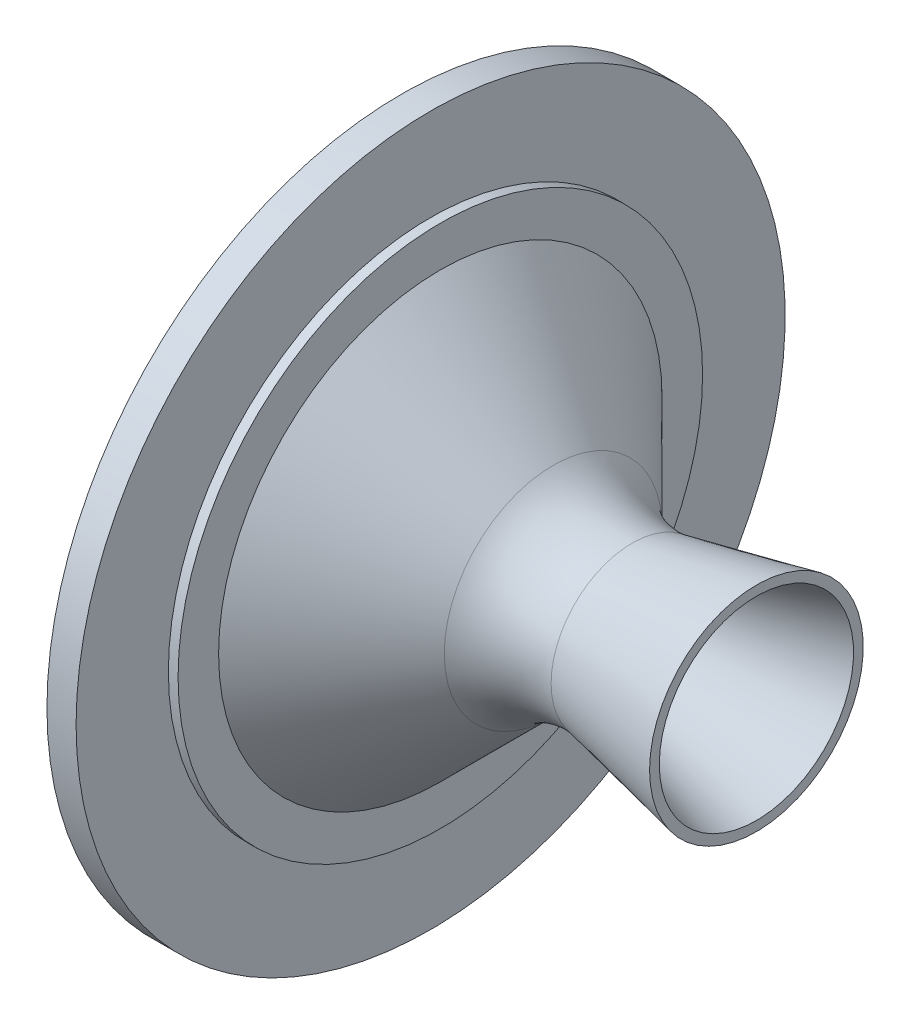
ISO-10303-21;
HEADER;
FILE_DESCRIPTION(('STEP AP214'),'2;1');
FILE_NAME('part.step','',(''),(''),'','','');
FILE_SCHEMA(('AUTOMOTIVE_DESIGN { 1 0 10303 214 1 1 1 1 }'));
ENDSEC;
DATA;
#1=APPLICATION_CONTEXT('core data for automotive mechanical design processes');
#2=APPLICATION_PROTOCOL_DEFINITION('international standard','automotive_design',2000,#1);
#3=PRODUCT_CONTEXT('',#1,'mechanical');
#4=PRODUCT('Part','Part','',(#3));
#5=PRODUCT_RELATED_PRODUCT_CATEGORY('part','',(#4));
#6=PRODUCT_DEFINITION_FORMATION('','',#4);
#7=PRODUCT_DEFINITION_CONTEXT('part definition',#1,'design');
#8=PRODUCT_DEFINITION('design','',#6,#7);
#9=PRODUCT_DEFINITION_SHAPE('','',#8);
#10=(LENGTH_UNIT() NAMED_UNIT(*) SI_UNIT(.MILLI.,.METRE.));
#11=(NAMED_UNIT(*) PLANE_ANGLE_UNIT() SI_UNIT($,.RADIAN.));
#12=(NAMED_UNIT(*) SI_UNIT($,.STERADIAN.) SOLID_ANGLE_UNIT());
#13=UNCERTAINTY_MEASURE_WITH_UNIT(LENGTH_MEASURE(1.E-05),#10,'distance_accuracy_value','');
#14=(GEOMETRIC_REPRESENTATION_CONTEXT(3) GLOBAL_UNCERTAINTY_ASSIGNED_CONTEXT((#13)) GLOBAL_UNIT_ASSIGNED_CONTEXT((#10,
#11,#12)) REPRESENTATION_CONTEXT('',''));
#15=CARTESIAN_POINT('',(0.,0.,0.));
#16=DIRECTION('',(0.,0.,1.));
#17=DIRECTION('',(1.,0.,0.));
#18=AXIS2_PLACEMENT_3D('',#15,#16,#17);
#19=CARTESIAN_POINT('',(-38.6300607834147,24.,0.));
#20=DIRECTION('',(1.,0.,0.));
#21=DIRECTION('',(0.,0.,-1.));
#22=AXIS2_PLACEMENT_3D('',#19,#20,#21);
#23=PLANE('',#22);
#24=CARTESIAN_POINT('',(-38.6300607834147,0.,0.));
#25=DIRECTION('',(-1.,0.,0.));
#26=DIRECTION('',(0.,0.,1.));
#27=AXIS2_PLACEMENT_3D('',#24,#25,#26);
#28=CIRCLE('',#27,24.);
#29=CARTESIAN_POINT('',(-38.6300607834147,0.,24.));
#30=VERTEX_POINT('',#29);
#31=EDGE_CURVE('E10',#30,#30,#28,.T.);
#32=ORIENTED_EDGE('',*,*,#31,.F.);
#33=EDGE_LOOP('',(#32));
#34=FACE_BOUND('',#33,.T.);
#35=CARTESIAN_POINT('',(-38.6300607834147,0.,0.));
#36=DIRECTION('',(-1.,0.,0.));
#37=DIRECTION('',(0.,0.,1.));
#38=AXIS2_PLACEMENT_3D('',#35,#36,#37);
#39=CIRCLE('',#38,36.5);
#40=CARTESIAN_POINT('',(-38.6300607834147,0.,36.5));
#41=VERTEX_POINT('',#40);
#42=EDGE_CURVE('E79',#41,#41,#39,.T.);
#43=ORIENTED_EDGE('',*,*,#42,.T.);
#44=EDGE_LOOP('',(#43));
#45=FACE_BOUND('',#44,.T.);
#46=ADVANCED_FACE('F36',(#34,#45),#23,.F.);
#47=CARTESIAN_POINT('',(-109.349560783415,0.,0.));
#48=DIRECTION('',(-1.,0.,0.));
#49=DIRECTION('',(0.,0.,1.));
#50=AXIS2_PLACEMENT_3D('',#47,#48,#49);
#51=CYLINDRICAL_SURFACE('',#50,24.);
#52=CARTESIAN_POINT('',(-36.6300607834147,0.,0.));
#53=DIRECTION('',(-1.,0.,0.));
#54=DIRECTION('',(0.,0.,1.));
#55=AXIS2_PLACEMENT_3D('',#52,#53,#54);
#56=CIRCLE('',#55,24.);
#57=CARTESIAN_POINT('',(-36.6300607834147,0.,24.));
#58=VERTEX_POINT('',#57);
#59=EDGE_CURVE('E42',#58,#58,#56,.T.);
#60=ORIENTED_EDGE('',*,*,#59,.F.);
#61=EDGE_LOOP('',(#60));
#62=FACE_BOUND('',#61,.T.);
#63=ORIENTED_EDGE('',*,*,#31,.T.);
#64=EDGE_LOOP('',(#63));
#65=FACE_BOUND('',#64,.T.);
#66=ADVANCED_FACE('F146',(#62,#65),#51,.F.);
#67=CARTESIAN_POINT('',(-36.6300607834147,24.,0.));
#68=DIRECTION('',(1.,0.,0.));
#69=DIRECTION('',(0.,0.,-1.));
#70=AXIS2_PLACEMENT_3D('',#67,#68,#69);
#71=PLANE('',#70);
#72=CARTESIAN_POINT('',(-36.6300607834147,0.,0.));
#73=DIRECTION('',(-1.,0.,0.));
#74=DIRECTION('',(0.,0.,1.));
#75=AXIS2_PLACEMENT_3D('',#72,#73,#74);
#76=CIRCLE('',#75,22.);
#77=CARTESIAN_POINT('',(-36.6300607834147,0.,22.));
#78=VERTEX_POINT('',#77);
#79=EDGE_CURVE('E46',#78,#78,#76,.T.);
#80=ORIENTED_EDGE('',*,*,#79,.F.);
#81=EDGE_LOOP('',(#80));
#82=FACE_BOUND('',#81,.T.);
#83=ORIENTED_EDGE('',*,*,#59,.T.);
#84=EDGE_LOOP('',(#83));
#85=FACE_BOUND('',#84,.T.);
#86=ADVANCED_FACE('F141',(#82,#85),#71,.F.);
#87=CARTESIAN_POINT('',(-36.6300607834147,0.,0.));
#88=DIRECTION('',(-1.,0.,0.));
#89=DIRECTION('',(0.,0.,1.));
#90=AXIS2_PLACEMENT_3D('',#87,#88,#89);
#91=CONICAL_SURFACE('',#90,22.,0.785387632900472);
#92=CARTESIAN_POINT('',(-19.5297006366256,0.,0.));
#93=DIRECTION('',(-1.,0.,0.));
#94=DIRECTION('',(0.,0.,1.));
#95=AXIS2_PLACEMENT_3D('',#92,#93,#94);
#96=CIRCLE('',#95,4.9);
#97=CARTESIAN_POINT('',(-19.5297006366256,0.,4.9));
#98=VERTEX_POINT('',#97);
#99=EDGE_CURVE('E50',#98,#98,#96,.T.);
#100=CARTESIAN_POINT('',(-19.5297006366256,0.,4.9));
#101=CARTESIAN_POINT('',(-19.7078293881547,0.,5.078125));
#102=CARTESIAN_POINT('',(-19.8859581396837,0.,5.25625));
#103=CARTESIAN_POINT('',(-20.2422156427418,0.,5.6125));
#104=CARTESIAN_POINT('',(-20.4203443942709,0.,5.790625));
#105=CARTESIAN_POINT('',(-20.776601897329,0.,6.146875));
#106=CARTESIAN_POINT('',(-20.954730648858,0.,6.325));
#107=CARTESIAN_POINT('',(-21.3109881519161,0.,6.68125));
#108=CARTESIAN_POINT('',(-21.4891169034452,0.,6.859375));
#109=CARTESIAN_POINT('',(-21.8453744065033,0.,7.215625));
#110=CARTESIAN_POINT('',(-22.0235031580323,0.,7.39375));
#111=CARTESIAN_POINT('',(-22.3797606610905,0.,7.75));
#112=CARTESIAN_POINT('',(-22.5578894126195,0.,7.928125));
#113=CARTESIAN_POINT('',(-22.9141469156776,0.,8.284375));
#114=CARTESIAN_POINT('',(-23.0922756672067,0.,8.4625));
#115=CARTESIAN_POINT('',(-23.4485331702648,0.,8.81875));
#116=CARTESIAN_POINT('',(-23.6266619217938,0.,8.996875));
#117=CARTESIAN_POINT('',(-23.9829194248519,0.,9.353125));
#118=CARTESIAN_POINT('',(-24.161048176381,0.,9.53125));
#119=CARTESIAN_POINT('',(-24.5173056794391,0.,9.8875));
#120=CARTESIAN_POINT('',(-24.6954344309681,0.,10.065625));
#121=CARTESIAN_POINT('',(-25.0516919340262,0.,10.421875));
#122=CARTESIAN_POINT('',(-25.2298206855553,0.,10.6));
#123=CARTESIAN_POINT('',(-25.5860781886134,0.,10.95625));
#124=CARTESIAN_POINT('',(-25.7642069401425,0.,11.134375));
#125=CARTESIAN_POINT('',(-26.1204644432006,0.,11.490625));
#126=CARTESIAN_POINT('',(-26.2985931947296,0.,11.66875));
#127=CARTESIAN_POINT('',(-26.6548506977877,0.,12.025));
#128=CARTESIAN_POINT('',(-26.8329794493168,0.,12.203125));
#129=CARTESIAN_POINT('',(-27.1892369523749,0.,12.559375));
#130=CARTESIAN_POINT('',(-27.3673657039039,0.,12.7375));
#131=CARTESIAN_POINT('',(-27.723623206962,0.,13.09375));
#132=CARTESIAN_POINT('',(-27.9017519584911,0.,13.271875));
#133=CARTESIAN_POINT('',(-28.2580094615492,0.,13.628125));
#134=CARTESIAN_POINT('',(-28.4361382130783,0.,13.80625));
#135=CARTESIAN_POINT('',(-28.7923957161364,0.,14.1625));
#136=CARTESIAN_POINT('',(-28.9705244676654,0.,14.340625));
#137=CARTESIAN_POINT('',(-29.3267819707235,0.,14.696875));
#138=CARTESIAN_POINT('',(-29.5049107222526,0.,14.875));
#139=CARTESIAN_POINT('',(-29.8611682253107,0.,15.23125));
#140=CARTESIAN_POINT('',(-30.0392969768397,0.,15.409375));
#141=CARTESIAN_POINT('',(-30.3955544798979,0.,15.765625));
#142=CARTESIAN_POINT('',(-30.5736832314269,0.,15.94375));
#143=CARTESIAN_POINT('',(-30.929940734485,0.,16.3));
#144=CARTESIAN_POINT('',(-31.1080694860141,0.,16.478125));
#145=CARTESIAN_POINT('',(-31.4643269890722,0.,16.834375));
#146=CARTESIAN_POINT('',(-31.6424557406012,0.,17.0125));
#147=CARTESIAN_POINT('',(-31.9987132436593,0.,17.36875));
#148=CARTESIAN_POINT('',(-32.1768419951884,0.,17.546875));
#149=CARTESIAN_POINT('',(-32.5330994982465,0.,17.903125));
#150=CARTESIAN_POINT('',(-32.7112282497755,0.,18.08125));
#151=CARTESIAN_POINT('',(-33.0674857528336,0.,18.4375));
#152=CARTESIAN_POINT('',(-33.2456145043627,0.,18.615625));
#153=CARTESIAN_POINT('',(-33.6018720074208,0.,18.971875));
#154=CARTESIAN_POINT('',(-33.7800007589499,0.,19.15));
#155=CARTESIAN_POINT('',(-34.136258262008,0.,19.50625));
#156=CARTESIAN_POINT('',(-34.314387013537,0.,19.684375));
#157=CARTESIAN_POINT('',(-34.6706445165951,0.,20.040625));
#158=CARTESIAN_POINT('',(-34.8487732681242,0.,20.21875));
#159=CARTESIAN_POINT('',(-35.2050307711823,0.,20.575));
#160=CARTESIAN_POINT('',(-35.3831595227113,0.,20.753125));
#161=CARTESIAN_POINT('',(-35.7394170257694,0.,21.109375));
#162=CARTESIAN_POINT('',(-35.9175457772985,0.,21.2875));
#163=CARTESIAN_POINT('',(-36.2738032803566,0.,21.64375));
#164=CARTESIAN_POINT('',(-36.4519320318857,0.,21.821875));
#165=CARTESIAN_POINT('',(-36.6300607834147,0.,22.));
#166=B_SPLINE_CURVE_WITH_KNOTS('',3,(#100,#101,#102,#103,#104,#105,#106,#107,#108,#109,#110,
#111,#112,#113,#114,#115,#116,#117,#118,#119,#120,#121,#122,#123,#124,#125,#126,#127,#128,#129,
#130,#131,#132,#133,#134,#135,#136,#137,#138,#139,#140,#141,#142,#143,#144,#145,#146,#147,#148,
#149,#150,#151,#152,#153,#154,#155,#156,#157,#158,#159,#160,#161,#162,#163,#164,#165),
.UNSPECIFIED.,.F.,.F.,(4,2,2,2,2,2,2,2,2,2,2,2,2,2,2,2,2,2,2,2,2,2,2,2,2,2,2,2,2,2,2,2,4),(0.,
0.755728330629921,1.51145666125985,2.26718499188977,3.0229133225197,3.77864165314962,
4.53436998377955,5.29009831440947,6.0458266450394,6.80155497566932,7.55728330629925,
8.31301163692917,9.06873996755909,9.82446829818902,10.5801966288189,11.3359249594489,
12.0916532900788,12.8473816207087,13.6031099513386,14.3588382819686,15.1145666125985,
15.8702949432284,16.6260232738583,17.3817516044883,18.1374799351182,18.8932082657481,
19.648936596378,20.404664927008,21.1603932576379,21.9161215882678,22.6718499188977,
23.4275782495277,24.1833065801576),.UNSPECIFIED.);
#167=EDGE_CURVE('BSEAM135',#98,#78,#166,.T.);
#168=ORIENTED_EDGE('',*,*,#99,.F.);
#169=ORIENTED_EDGE('',*,*,#79,.T.);
#170=ORIENTED_EDGE('',*,*,#167,.T.);
#171=ORIENTED_EDGE('',*,*,#167,.F.);
#172=EDGE_LOOP('',(#168,#170,#169,#171));
#173=FACE_BOUND('',#172,.T.);
#174=ADVANCED_FACE('F135',(#173),#91,.F.);
#175=CARTESIAN_POINT('',(-19.5297006366256,0.,0.));
#176=DIRECTION('',(1.,0.,0.));
#177=DIRECTION('',(0.,0.,-1.));
#178=AXIS2_PLACEMENT_3D('',#175,#176,#177);
#179=CONICAL_SURFACE('',#178,4.9,0.284488668075077);
#180=CARTESIAN_POINT('',(-2.08906078341471,0.,0.));
#181=DIRECTION('',(-1.,0.,0.));
#182=DIRECTION('',(0.,0.,1.));
#183=AXIS2_PLACEMENT_3D('',#180,#181,#182);
#184=CIRCLE('',#183,10.);
#185=CARTESIAN_POINT('',(-2.08906078341471,0.,10.));
#186=VERTEX_POINT('',#185);
#187=EDGE_CURVE('E55',#186,#186,#184,.T.);
#188=ORIENTED_EDGE('',*,*,#187,.F.);
#189=EDGE_LOOP('',(#188));
#190=FACE_BOUND('',#189,.T.);
#191=ORIENTED_EDGE('',*,*,#99,.T.);
#192=EDGE_LOOP('',(#191));
#193=FACE_BOUND('',#192,.T.);
#194=ADVANCED_FACE('F129',(#190,#193),#179,.F.);
#195=CARTESIAN_POINT('',(-2.08906078341471,10.,0.));
#196=DIRECTION('',(-1.,0.,0.));
#197=DIRECTION('',(0.,0.,1.));
#198=AXIS2_PLACEMENT_3D('',#195,#196,#197);
#199=PLANE('',#198);
#200=CARTESIAN_POINT('',(-2.08906078341471,0.,0.));
#201=DIRECTION('',(-1.,0.,0.));
#202=DIRECTION('',(0.,0.,1.));
#203=AXIS2_PLACEMENT_3D('',#200,#201,#202);
#204=CIRCLE('',#203,11.);
#205=CARTESIAN_POINT('',(-2.08906078341471,0.,11.));
#206=VERTEX_POINT('',#205);
#207=EDGE_CURVE('E58',#206,#206,#204,.T.);
#208=ORIENTED_EDGE('',*,*,#207,.F.);
#209=EDGE_LOOP('',(#208));
#210=FACE_BOUND('',#209,.T.);
#211=ORIENTED_EDGE('',*,*,#187,.T.);
#212=EDGE_LOOP('',(#211));
#213=FACE_BOUND('',#212,.T.);
#214=ADVANCED_FACE('F123',(#210,#213),#199,.F.);
#215=CARTESIAN_POINT('',(-2.08906078341471,0.,0.));
#216=DIRECTION('',(1.,0.,0.));
#217=DIRECTION('',(0.,0.,-1.));
#218=AXIS2_PLACEMENT_3D('',#215,#216,#217);
#219=CONICAL_SURFACE('',#218,11.,0.20478130712387);
#220=CARTESIAN_POINT('',(-14.880094771447,0.,0.));
#221=DIRECTION('',(-1.,0.,0.));
#222=DIRECTION('',(0.,0.,1.));
#223=AXIS2_PLACEMENT_3D('',#220,#221,#222);
#224=CIRCLE('',#223,8.34339586746507);
#225=CARTESIAN_POINT('',(-14.880094771447,0.,8.34339586746507));
#226=VERTEX_POINT('',#225);
#227=EDGE_CURVE('E61',#226,#226,#224,.T.);
#228=ORIENTED_EDGE('',*,*,#227,.F.);
#229=EDGE_LOOP('',(#228));
#230=FACE_BOUND('',#229,.T.);
#231=ORIENTED_EDGE('',*,*,#207,.T.);
#232=EDGE_LOOP('',(#231));
#233=FACE_BOUND('',#232,.T.);
#234=ADVANCED_FACE('F117',(#230,#233),#219,.T.);
#235=CARTESIAN_POINT('',(-15.9456997681713,0.,0.));
#236=DIRECTION('',(-1.,0.,0.));
#237=DIRECTION('',(0.,0.,1.));
#238=AXIS2_PLACEMENT_3D('',#235,#236,#237);
#239=TOROIDAL_SURFACE('',#238,18.2864580713817,10.);
#240=CARTESIAN_POINT('',(-23.0146592317481,0.,0.));
#241=DIRECTION('',(-1.,0.,0.));
#242=DIRECTION('',(0.,0.,1.));
#243=AXIS2_PLACEMENT_3D('',#240,#241,#242);
#244=CIRCLE('',#243,11.2132825396769);
#245=CARTESIAN_POINT('',(-23.0146592317481,0.,11.2132825396769));
#246=VERTEX_POINT('',#245);
#247=EDGE_CURVE('E64',#246,#246,#244,.T.);
#248=ORIENTED_EDGE('',*,*,#247,.F.);
#249=EDGE_LOOP('',(#248));
#250=FACE_BOUND('',#249,.T.);
#251=ORIENTED_EDGE('',*,*,#227,.T.);
#252=EDGE_LOOP('',(#251));
#253=FACE_BOUND('',#252,.T.);
#254=ADVANCED_FACE('F111',(#250,#253),#239,.F.);
#255=CARTESIAN_POINT('',(-23.0146592317481,0.,0.));
#256=DIRECTION('',(-1.,0.,0.));
#257=DIRECTION('',(0.,0.,1.));
#258=AXIS2_PLACEMENT_3D('',#255,#256,#257);
#259=CONICAL_SURFACE('',#258,11.2132825396769,0.785387632900472);
#260=CARTESIAN_POINT('',(-34.6300607834147,0.,0.));
#261=DIRECTION('',(-1.,0.,0.));
#262=DIRECTION('',(0.,0.,1.));
#263=AXIS2_PLACEMENT_3D('',#260,#261,#262);
#264=CIRCLE('',#263,22.8284394620177);
#265=CARTESIAN_POINT('',(-34.6300607834147,0.,22.8284394620177));
#266=VERTEX_POINT('',#265);
#267=EDGE_CURVE('E67',#266,#266,#264,.T.);
#268=ORIENTED_EDGE('',*,*,#267,.F.);
#269=EDGE_LOOP('',(#268));
#270=FACE_BOUND('',#269,.T.);
#271=ORIENTED_EDGE('',*,*,#247,.T.);
#272=EDGE_LOOP('',(#271));
#273=FACE_BOUND('',#272,.T.);
#274=ADVANCED_FACE('F105',(#270,#273),#259,.T.);
#275=CARTESIAN_POINT('',(-34.6300607834147,27.,0.));
#276=DIRECTION('',(-1.,0.,0.));
#277=DIRECTION('',(0.,0.,1.));
#278=AXIS2_PLACEMENT_3D('',#275,#276,#277);
#279=PLANE('',#278);
#280=CARTESIAN_POINT('',(-34.6300607834147,0.,0.));
#281=DIRECTION('',(-1.,0.,0.));
#282=DIRECTION('',(0.,0.,1.));
#283=AXIS2_PLACEMENT_3D('',#280,#281,#282);
#284=CIRCLE('',#283,27.);
#285=CARTESIAN_POINT('',(-34.6300607834147,0.,27.));
#286=VERTEX_POINT('',#285);
#287=EDGE_CURVE('E70',#286,#286,#284,.T.);
#288=ORIENTED_EDGE('',*,*,#287,.F.);
#289=EDGE_LOOP('',(#288));
#290=FACE_BOUND('',#289,.T.);
#291=ORIENTED_EDGE('',*,*,#267,.T.);
#292=EDGE_LOOP('',(#291));
#293=FACE_BOUND('',#292,.T.);
#294=ADVANCED_FACE('F99',(#290,#293),#279,.F.);
#295=CARTESIAN_POINT('',(-109.349560783415,0.,0.));
#296=DIRECTION('',(-1.,0.,0.));
#297=DIRECTION('',(0.,0.,1.));
#298=AXIS2_PLACEMENT_3D('',#295,#296,#297);
#299=CYLINDRICAL_SURFACE('',#298,27.);
#300=CARTESIAN_POINT('',(-35.6300607834147,0.,0.));
#301=DIRECTION('',(-1.,0.,0.));
#302=DIRECTION('',(0.,0.,1.));
#303=AXIS2_PLACEMENT_3D('',#300,#301,#302);
#304=CIRCLE('',#303,27.);
#305=CARTESIAN_POINT('',(-35.6300607834147,0.,27.));
#306=VERTEX_POINT('',#305);
#307=EDGE_CURVE('E73',#306,#306,#304,.T.);
#308=ORIENTED_EDGE('',*,*,#307,.F.);
#309=EDGE_LOOP('',(#308));
#310=FACE_BOUND('',#309,.T.);
#311=ORIENTED_EDGE('',*,*,#287,.T.);
#312=EDGE_LOOP('',(#311));
#313=FACE_BOUND('',#312,.T.);
#314=ADVANCED_FACE('F93',(#310,#313),#299,.T.);
#315=CARTESIAN_POINT('',(-35.6300607834147,36.5,0.));
#316=DIRECTION('',(-1.,0.,0.));
#317=DIRECTION('',(0.,0.,1.));
#318=AXIS2_PLACEMENT_3D('',#315,#316,#317);
#319=PLANE('',#318);
#320=CARTESIAN_POINT('',(-35.6300607834147,0.,0.));
#321=DIRECTION('',(-1.,0.,0.));
#322=DIRECTION('',(0.,0.,1.));
#323=AXIS2_PLACEMENT_3D('',#320,#321,#322);
#324=CIRCLE('',#323,36.5);
#325=CARTESIAN_POINT('',(-35.6300607834147,0.,36.5));
#326=VERTEX_POINT('',#325);
#327=EDGE_CURVE('E76',#326,#326,#324,.T.);
#328=ORIENTED_EDGE('',*,*,#327,.F.);
#329=EDGE_LOOP('',(#328));
#330=FACE_BOUND('',#329,.T.);
#331=ORIENTED_EDGE('',*,*,#307,.T.);
#332=EDGE_LOOP('',(#331));
#333=FACE_BOUND('',#332,.T.);
#334=ADVANCED_FACE('F87',(#330,#333),#319,.F.);
#335=CARTESIAN_POINT('',(-109.349560783415,0.,0.));
#336=DIRECTION('',(-1.,0.,0.));
#337=DIRECTION('',(0.,0.,1.));
#338=AXIS2_PLACEMENT_3D('',#335,#336,#337);
#339=CYLINDRICAL_SURFACE('',#338,36.5);
#340=ORIENTED_EDGE('',*,*,#42,.F.);
#341=EDGE_LOOP('',(#340));
#342=FACE_BOUND('',#341,.T.);
#343=ORIENTED_EDGE('',*,*,#327,.T.);
#344=EDGE_LOOP('',(#343));
#345=FACE_BOUND('',#344,.T.);
#346=ADVANCED_FACE('F84',(#342,#345),#339,.T.);
#347=CLOSED_SHELL('',(#46,#66,#86,#174,#194,#214,#234,#254,#274,#294,#314,#334,#346));
#348=MANIFOLD_SOLID_BREP('B2',#347);
#349=ADVANCED_BREP_SHAPE_REPRESENTATION('',(#18,#348),#14);
#350=SHAPE_DEFINITION_REPRESENTATION(#9,#349);
ENDSEC;
END-ISO-10303-21;
